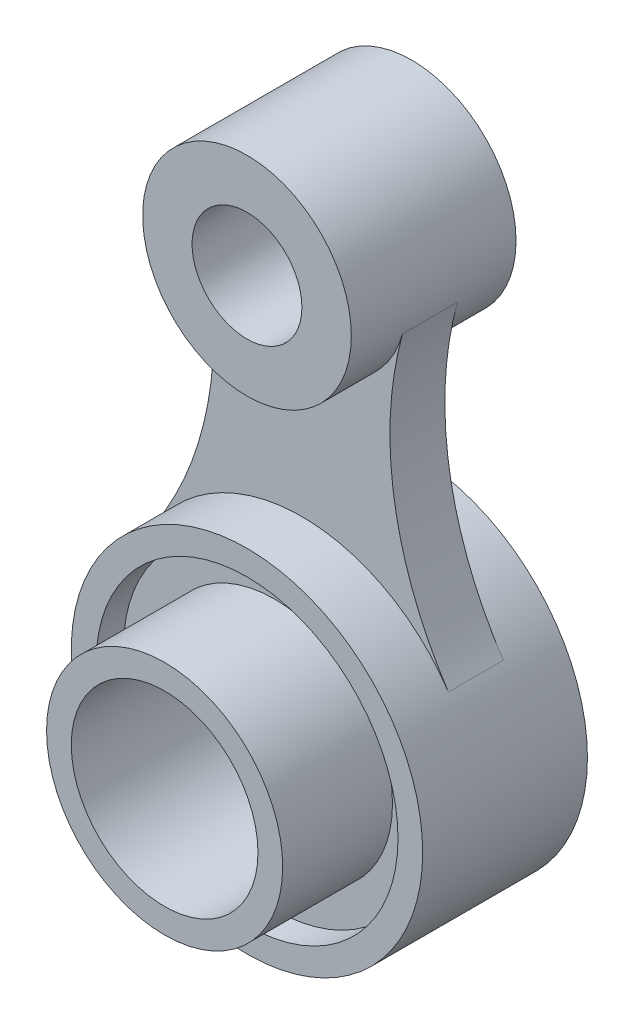
ISO-10303-21;
HEADER;
FILE_DESCRIPTION(('STEP AP214'),'2;1');
FILE_NAME('part.step','',(''),(''),'','','');
FILE_SCHEMA(('AUTOMOTIVE_DESIGN { 1 0 10303 214 1 1 1 1 }'));
ENDSEC;
DATA;
#1=APPLICATION_CONTEXT('core data for automotive mechanical design processes');
#2=APPLICATION_PROTOCOL_DEFINITION('international standard','automotive_design',2000,#1);
#3=PRODUCT_CONTEXT('',#1,'mechanical');
#4=PRODUCT('Part','Part','',(#3));
#5=PRODUCT_RELATED_PRODUCT_CATEGORY('part','',(#4));
#6=PRODUCT_DEFINITION_FORMATION('','',#4);
#7=PRODUCT_DEFINITION_CONTEXT('part definition',#1,'design');
#8=PRODUCT_DEFINITION('design','',#6,#7);
#9=PRODUCT_DEFINITION_SHAPE('','',#8);
#10=(LENGTH_UNIT() NAMED_UNIT(*) SI_UNIT(.MILLI.,.METRE.));
#11=(NAMED_UNIT(*) PLANE_ANGLE_UNIT() SI_UNIT($,.RADIAN.));
#12=(NAMED_UNIT(*) SI_UNIT($,.STERADIAN.) SOLID_ANGLE_UNIT());
#13=UNCERTAINTY_MEASURE_WITH_UNIT(LENGTH_MEASURE(1.E-05),#10,'distance_accuracy_value','');
#14=(GEOMETRIC_REPRESENTATION_CONTEXT(3) GLOBAL_UNCERTAINTY_ASSIGNED_CONTEXT((#13)) GLOBAL_UNIT_ASSIGNED_CONTEXT((#10,
#11,#12)) REPRESENTATION_CONTEXT('',''));
#15=CARTESIAN_POINT('',(0.,0.,0.));
#16=DIRECTION('',(0.,0.,1.));
#17=DIRECTION('',(1.,0.,0.));
#18=AXIS2_PLACEMENT_3D('',#15,#16,#17);
#19=CARTESIAN_POINT('',(0.,75.,15.));
#20=DIRECTION('',(0.,0.,1.));
#21=DIRECTION('',(1.,0.,0.));
#22=AXIS2_PLACEMENT_3D('',#19,#20,#21);
#23=PLANE('',#22);
#24=CARTESIAN_POINT('',(0.,75.,15.));
#25=DIRECTION('',(0.,0.,1.));
#26=DIRECTION('',(1.,0.,0.));
#27=AXIS2_PLACEMENT_3D('',#24,#25,#26);
#28=CIRCLE('',#27,19.);
#29=CARTESIAN_POINT('',(19.,75.,15.));
#30=VERTEX_POINT('',#29);
#31=EDGE_CURVE('E12',#30,#30,#28,.T.);
#32=ORIENTED_EDGE('',*,*,#31,.T.);
#33=EDGE_LOOP('',(#32));
#34=FACE_BOUND('',#33,.T.);
#35=CARTESIAN_POINT('',(0.,75.,15.));
#36=DIRECTION('',(0.,0.,1.));
#37=DIRECTION('',(1.,0.,0.));
#38=AXIS2_PLACEMENT_3D('',#35,#36,#37);
#39=CIRCLE('',#38,10.);
#40=CARTESIAN_POINT('',(10.,75.,15.));
#41=VERTEX_POINT('',#40);
#42=EDGE_CURVE('E127',#41,#41,#39,.T.);
#43=ORIENTED_EDGE('',*,*,#42,.F.);
#44=EDGE_LOOP('',(#43));
#45=FACE_BOUND('',#44,.T.);
#46=ADVANCED_FACE('F51',(#34,#45),#23,.T.);
#47=CARTESIAN_POINT('',(0.,75.,-15.));
#48=DIRECTION('',(0.,0.,1.));
#49=DIRECTION('',(1.,0.,0.));
#50=AXIS2_PLACEMENT_3D('',#47,#48,#49);
#51=PLANE('',#50);
#52=CARTESIAN_POINT('',(0.,75.,-15.));
#53=DIRECTION('',(0.,0.,1.));
#54=DIRECTION('',(1.,0.,0.));
#55=AXIS2_PLACEMENT_3D('',#52,#53,#54);
#56=CIRCLE('',#55,19.);
#57=CARTESIAN_POINT('',(19.,75.,-15.));
#58=VERTEX_POINT('',#57);
#59=EDGE_CURVE('E55',#58,#58,#56,.T.);
#60=ORIENTED_EDGE('',*,*,#59,.F.);
#61=EDGE_LOOP('',(#60));
#62=FACE_BOUND('',#61,.T.);
#63=CARTESIAN_POINT('',(0.,75.,-15.));
#64=DIRECTION('',(0.,0.,1.));
#65=DIRECTION('',(1.,0.,0.));
#66=AXIS2_PLACEMENT_3D('',#63,#64,#65);
#67=CIRCLE('',#66,10.);
#68=CARTESIAN_POINT('',(10.,75.,-15.));
#69=VERTEX_POINT('',#68);
#70=EDGE_CURVE('E126',#69,#69,#67,.T.);
#71=ORIENTED_EDGE('',*,*,#70,.T.);
#72=EDGE_LOOP('',(#71));
#73=FACE_BOUND('',#72,.T.);
#74=ADVANCED_FACE('F133',(#62,#73),#51,.F.);
#75=CARTESIAN_POINT('',(0.,75.,15.));
#76=DIRECTION('',(0.,0.,-1.));
#77=DIRECTION('',(-1.,0.,0.));
#78=AXIS2_PLACEMENT_3D('',#75,#76,#77);
#79=CYLINDRICAL_SURFACE('',#78,19.);
#80=DIRECTION('',(0.,0.,-1.));
#81=VECTOR('',#80,1.);
#82=CARTESIAN_POINT('',(-18.3212439861572,69.9669076305221,5.));
#83=LINE('',#82,#81);
#84=CARTESIAN_POINT('',(-18.3212439861572,69.9669076305221,5.));
#85=VERTEX_POINT('',#84);
#86=CARTESIAN_POINT('',(-18.3212439861572,69.9669076305221,-5.));
#87=VERTEX_POINT('',#86);
#88=EDGE_CURVE('E66',#85,#87,#83,.T.);
#89=ORIENTED_EDGE('',*,*,#88,.F.);
#90=CARTESIAN_POINT('',(0.,75.,5.));
#91=DIRECTION('',(0.,0.,-1.));
#92=DIRECTION('',(1.,0.,0.));
#93=AXIS2_PLACEMENT_3D('',#90,#91,#92);
#94=CIRCLE('',#93,19.);
#95=CARTESIAN_POINT('',(18.3212439861572,69.9669076305221,5.));
#96=VERTEX_POINT('',#95);
#97=EDGE_CURVE('E70',#96,#85,#94,.T.);
#98=ORIENTED_EDGE('',*,*,#97,.F.);
#99=DIRECTION('',(0.,0.,-1.));
#100=VECTOR('',#99,1.);
#101=CARTESIAN_POINT('',(18.3212439861572,69.9669076305221,5.));
#102=LINE('',#101,#100);
#103=CARTESIAN_POINT('',(18.3212439861572,69.9669076305221,-5.));
#104=VERTEX_POINT('',#103);
#105=EDGE_CURVE('E109',#96,#104,#102,.T.);
#106=ORIENTED_EDGE('',*,*,#105,.T.);
#107=CARTESIAN_POINT('',(0.,75.,-5.));
#108=DIRECTION('',(0.,0.,-1.));
#109=DIRECTION('',(1.,0.,0.));
#110=AXIS2_PLACEMENT_3D('',#107,#108,#109);
#111=CIRCLE('',#110,19.);
#112=EDGE_CURVE('E97',#104,#87,#111,.T.);
#113=ORIENTED_EDGE('',*,*,#112,.T.);
#114=EDGE_LOOP('',(#89,#98,#106,#113));
#115=FACE_BOUND('',#114,.T.);
#116=ORIENTED_EDGE('',*,*,#31,.F.);
#117=EDGE_LOOP('',(#116));
#118=FACE_BOUND('',#117,.T.);
#119=ORIENTED_EDGE('',*,*,#59,.T.);
#120=EDGE_LOOP('',(#119));
#121=FACE_BOUND('',#120,.T.);
#122=ADVANCED_FACE('F53',(#115,#118,#121),#79,.T.);
#123=CARTESIAN_POINT('',(0.,75.,15.));
#124=DIRECTION('',(0.,0.,-1.));
#125=DIRECTION('',(-1.,0.,0.));
#126=AXIS2_PLACEMENT_3D('',#123,#124,#125);
#127=CYLINDRICAL_SURFACE('',#126,10.);
#128=ORIENTED_EDGE('',*,*,#42,.T.);
#129=EDGE_LOOP('',(#128));
#130=FACE_BOUND('',#129,.T.);
#131=ORIENTED_EDGE('',*,*,#70,.F.);
#132=EDGE_LOOP('',(#131));
#133=FACE_BOUND('',#132,.T.);
#134=ADVANCED_FACE('F135',(#130,#133),#127,.F.);
#135=CARTESIAN_POINT('',(-80.034907939529,53.0133333333333,5.));
#136=DIRECTION('',(0.,0.,-1.));
#137=DIRECTION('',(-1.,0.,0.));
#138=AXIS2_PLACEMENT_3D('',#135,#136,#137);
#139=CYLINDRICAL_SURFACE('',#138,64.);
#140=CARTESIAN_POINT('',(-80.034907939529,53.0133333333333,-5.));
#141=DIRECTION('',(0.,0.,-1.));
#142=DIRECTION('',(1.,0.,0.));
#143=AXIS2_PLACEMENT_3D('',#140,#141,#142);
#144=CIRCLE('',#143,64.);
#145=CARTESIAN_POINT('',(-26.6783026465097,17.6711111111111,-5.));
#146=VERTEX_POINT('',#145);
#147=EDGE_CURVE('E115',#87,#146,#144,.T.);
#148=ORIENTED_EDGE('',*,*,#147,.T.);
#149=DIRECTION('',(0.,0.,-1.));
#150=VECTOR('',#149,1.);
#151=CARTESIAN_POINT('',(-26.6783026465097,17.6711111111111,5.));
#152=LINE('',#151,#150);
#153=CARTESIAN_POINT('',(-26.6783026465097,17.6711111111111,5.));
#154=VERTEX_POINT('',#153);
#155=EDGE_CURVE('E108',#154,#146,#152,.T.);
#156=ORIENTED_EDGE('',*,*,#155,.F.);
#157=CARTESIAN_POINT('',(-80.034907939529,53.0133333333333,5.));
#158=DIRECTION('',(0.,0.,-1.));
#159=DIRECTION('',(1.,0.,0.));
#160=AXIS2_PLACEMENT_3D('',#157,#158,#159);
#161=CIRCLE('',#160,64.);
#162=EDGE_CURVE('E122',#85,#154,#161,.T.);
#163=ORIENTED_EDGE('',*,*,#162,.F.);
#164=ORIENTED_EDGE('',*,*,#88,.T.);
#165=EDGE_LOOP('',(#148,#156,#163,#164));
#166=FACE_BOUND('',#165,.T.);
#167=ADVANCED_FACE('F137',(#166),#139,.F.);
#168=CARTESIAN_POINT('',(80.034907939529,53.0133333333333,5.));
#169=DIRECTION('',(0.,0.,-1.));
#170=DIRECTION('',(-1.,0.,0.));
#171=AXIS2_PLACEMENT_3D('',#168,#169,#170);
#172=CYLINDRICAL_SURFACE('',#171,64.);
#173=CARTESIAN_POINT('',(80.034907939529,53.0133333333333,-5.));
#174=DIRECTION('',(0.,0.,-1.));
#175=DIRECTION('',(1.,0.,0.));
#176=AXIS2_PLACEMENT_3D('',#173,#174,#175);
#177=CIRCLE('',#176,64.);
#178=CARTESIAN_POINT('',(26.6783026465097,17.6711111111111,-5.));
#179=VERTEX_POINT('',#178);
#180=EDGE_CURVE('E90',#179,#104,#177,.T.);
#181=ORIENTED_EDGE('',*,*,#180,.T.);
#182=ORIENTED_EDGE('',*,*,#105,.F.);
#183=CARTESIAN_POINT('',(80.034907939529,53.0133333333333,5.));
#184=DIRECTION('',(0.,0.,-1.));
#185=DIRECTION('',(1.,0.,0.));
#186=AXIS2_PLACEMENT_3D('',#183,#184,#185);
#187=CIRCLE('',#186,64.);
#188=CARTESIAN_POINT('',(26.6783026465097,17.6711111111111,5.));
#189=VERTEX_POINT('',#188);
#190=EDGE_CURVE('E105',#189,#96,#187,.T.);
#191=ORIENTED_EDGE('',*,*,#190,.F.);
#192=DIRECTION('',(0.,0.,-1.));
#193=VECTOR('',#192,1.);
#194=CARTESIAN_POINT('',(26.6783026465097,17.6711111111111,5.));
#195=LINE('',#194,#193);
#196=EDGE_CURVE('E103',#189,#179,#195,.T.);
#197=ORIENTED_EDGE('',*,*,#196,.T.);
#198=EDGE_LOOP('',(#181,#182,#191,#197));
#199=FACE_BOUND('',#198,.T.);
#200=ADVANCED_FACE('F104',(#199),#172,.F.);
#201=CARTESIAN_POINT('',(-40.0174539697645,64.0066666666667,5.));
#202=DIRECTION('',(0.,0.,1.));
#203=DIRECTION('',(1.,0.,0.));
#204=AXIS2_PLACEMENT_3D('',#201,#202,#203);
#205=PLANE('',#204);
#206=ORIENTED_EDGE('',*,*,#162,.T.);
#207=CARTESIAN_POINT('',(0.,0.,5.));
#208=DIRECTION('',(0.,0.,-1.));
#209=DIRECTION('',(1.,0.,0.));
#210=AXIS2_PLACEMENT_3D('',#207,#208,#209);
#211=CIRCLE('',#210,32.);
#212=EDGE_CURVE('E389',#154,#189,#211,.T.);
#213=ORIENTED_EDGE('',*,*,#212,.T.);
#214=ORIENTED_EDGE('',*,*,#190,.T.);
#215=ORIENTED_EDGE('',*,*,#97,.T.);
#216=EDGE_LOOP('',(#206,#213,#214,#215));
#217=FACE_BOUND('',#216,.T.);
#218=ADVANCED_FACE('F190',(#217),#205,.T.);
#219=CARTESIAN_POINT('',(-40.0174539697645,64.0066666666667,-5.));
#220=DIRECTION('',(0.,0.,1.));
#221=DIRECTION('',(1.,0.,0.));
#222=AXIS2_PLACEMENT_3D('',#219,#220,#221);
#223=PLANE('',#222);
#224=ORIENTED_EDGE('',*,*,#147,.F.);
#225=ORIENTED_EDGE('',*,*,#112,.F.);
#226=ORIENTED_EDGE('',*,*,#180,.F.);
#227=CARTESIAN_POINT('',(0.,0.,-5.));
#228=DIRECTION('',(0.,0.,-1.));
#229=DIRECTION('',(1.,0.,0.));
#230=AXIS2_PLACEMENT_3D('',#227,#228,#229);
#231=CIRCLE('',#230,32.);
#232=EDGE_CURVE('E95',#146,#179,#231,.T.);
#233=ORIENTED_EDGE('',*,*,#232,.F.);
#234=EDGE_LOOP('',(#224,#225,#226,#233));
#235=FACE_BOUND('',#234,.T.);
#236=ADVANCED_FACE('F93',(#235),#223,.F.);
#237=CARTESIAN_POINT('',(0.,0.,15.));
#238=DIRECTION('',(0.,0.,1.));
#239=DIRECTION('',(1.,0.,0.));
#240=AXIS2_PLACEMENT_3D('',#237,#238,#239);
#241=PLANE('',#240);
#242=CARTESIAN_POINT('',(0.,0.,15.));
#243=DIRECTION('',(0.,0.,1.));
#244=DIRECTION('',(1.,0.,0.));
#245=AXIS2_PLACEMENT_3D('',#242,#243,#244);
#246=CIRCLE('',#245,27.5);
#247=CARTESIAN_POINT('',(27.5,0.,15.));
#248=VERTEX_POINT('',#247);
#249=EDGE_CURVE('E374',#248,#248,#246,.T.);
#250=ORIENTED_EDGE('',*,*,#249,.F.);
#251=EDGE_LOOP('',(#250));
#252=FACE_BOUND('',#251,.T.);
#253=CARTESIAN_POINT('',(0.,0.,15.));
#254=DIRECTION('',(0.,0.,1.));
#255=DIRECTION('',(1.,0.,0.));
#256=AXIS2_PLACEMENT_3D('',#253,#254,#255);
#257=CIRCLE('',#256,32.);
#258=CARTESIAN_POINT('',(32.,0.,15.));
#259=VERTEX_POINT('',#258);
#260=EDGE_CURVE('E117',#259,#259,#257,.T.);
#261=ORIENTED_EDGE('',*,*,#260,.T.);
#262=EDGE_LOOP('',(#261));
#263=FACE_BOUND('',#262,.T.);
#264=ADVANCED_FACE('F209',(#252,#263),#241,.T.);
#265=CARTESIAN_POINT('',(0.,0.,-15.));
#266=DIRECTION('',(0.,0.,1.));
#267=DIRECTION('',(1.,0.,0.));
#268=AXIS2_PLACEMENT_3D('',#265,#266,#267);
#269=PLANE('',#268);
#270=CARTESIAN_POINT('',(0.,0.,-15.));
#271=DIRECTION('',(0.,0.,1.));
#272=DIRECTION('',(1.,0.,0.));
#273=AXIS2_PLACEMENT_3D('',#270,#271,#272);
#274=CIRCLE('',#273,32.);
#275=CARTESIAN_POINT('',(32.,0.,-15.));
#276=VERTEX_POINT('',#275);
#277=EDGE_CURVE('E383',#276,#276,#274,.T.);
#278=ORIENTED_EDGE('',*,*,#277,.F.);
#279=EDGE_LOOP('',(#278));
#280=FACE_BOUND('',#279,.T.);
#281=CARTESIAN_POINT('',(0.,0.,-15.));
#282=DIRECTION('',(0.,0.,1.));
#283=DIRECTION('',(1.,0.,0.));
#284=AXIS2_PLACEMENT_3D('',#281,#282,#283);
#285=CIRCLE('',#284,17.);
#286=CARTESIAN_POINT('',(17.,0.,-15.));
#287=VERTEX_POINT('',#286);
#288=EDGE_CURVE('E378',#287,#287,#285,.T.);
#289=ORIENTED_EDGE('',*,*,#288,.T.);
#290=EDGE_LOOP('',(#289));
#291=FACE_BOUND('',#290,.T.);
#292=ADVANCED_FACE('F218',(#280,#291),#269,.F.);
#293=CARTESIAN_POINT('',(0.,0.,15.));
#294=DIRECTION('',(0.,0.,-1.));
#295=DIRECTION('',(-1.,0.,0.));
#296=AXIS2_PLACEMENT_3D('',#293,#294,#295);
#297=CYLINDRICAL_SURFACE('',#296,32.);
#298=ORIENTED_EDGE('',*,*,#212,.F.);
#299=ORIENTED_EDGE('',*,*,#155,.T.);
#300=ORIENTED_EDGE('',*,*,#232,.T.);
#301=ORIENTED_EDGE('',*,*,#196,.F.);
#302=EDGE_LOOP('',(#298,#299,#300,#301));
#303=FACE_BOUND('',#302,.T.);
#304=ORIENTED_EDGE('',*,*,#260,.F.);
#305=EDGE_LOOP('',(#304));
#306=FACE_BOUND('',#305,.T.);
#307=ORIENTED_EDGE('',*,*,#277,.T.);
#308=EDGE_LOOP('',(#307));
#309=FACE_BOUND('',#308,.T.);
#310=ADVANCED_FACE('F112',(#303,#306,#309),#297,.T.);
#311=CARTESIAN_POINT('',(0.,0.,15.));
#312=DIRECTION('',(0.,0.,-1.));
#313=DIRECTION('',(-1.,0.,0.));
#314=AXIS2_PLACEMENT_3D('',#311,#312,#313);
#315=CYLINDRICAL_SURFACE('',#314,17.);
#316=ORIENTED_EDGE('',*,*,#288,.F.);
#317=EDGE_LOOP('',(#316));
#318=FACE_BOUND('',#317,.T.);
#319=CARTESIAN_POINT('',(0.,0.,30.));
#320=DIRECTION('',(0.,0.,1.));
#321=DIRECTION('',(1.,0.,0.));
#322=AXIS2_PLACEMENT_3D('',#319,#320,#321);
#323=CIRCLE('',#322,17.);
#324=CARTESIAN_POINT('',(17.,0.,30.));
#325=VERTEX_POINT('',#324);
#326=EDGE_CURVE('E366',#325,#325,#323,.T.);
#327=ORIENTED_EDGE('',*,*,#326,.T.);
#328=EDGE_LOOP('',(#327));
#329=FACE_BOUND('',#328,.T.);
#330=ADVANCED_FACE('F236',(#318,#329),#315,.F.);
#331=CARTESIAN_POINT('',(0.,0.,10.));
#332=DIRECTION('',(0.,0.,1.));
#333=DIRECTION('',(1.,0.,0.));
#334=AXIS2_PLACEMENT_3D('',#331,#332,#333);
#335=CYLINDRICAL_SURFACE('',#334,27.5);
#336=CARTESIAN_POINT('',(0.,0.,10.));
#337=DIRECTION('',(0.,0.,1.));
#338=DIRECTION('',(1.,0.,0.));
#339=AXIS2_PLACEMENT_3D('',#336,#337,#338);
#340=CIRCLE('',#339,27.5);
#341=CARTESIAN_POINT('',(27.5,0.,10.));
#342=VERTEX_POINT('',#341);
#343=EDGE_CURVE('E375',#342,#342,#340,.T.);
#344=ORIENTED_EDGE('',*,*,#343,.F.);
#345=EDGE_LOOP('',(#344));
#346=FACE_BOUND('',#345,.T.);
#347=ORIENTED_EDGE('',*,*,#249,.T.);
#348=EDGE_LOOP('',(#347));
#349=FACE_BOUND('',#348,.T.);
#350=ADVANCED_FACE('F244',(#346,#349),#335,.F.);
#351=CARTESIAN_POINT('',(0.,0.,10.));
#352=DIRECTION('',(0.,0.,1.));
#353=DIRECTION('',(1.,0.,0.));
#354=AXIS2_PLACEMENT_3D('',#351,#352,#353);
#355=PLANE('',#354);
#356=CARTESIAN_POINT('',(0.,0.,10.));
#357=DIRECTION('',(0.,0.,1.));
#358=DIRECTION('',(1.,0.,0.));
#359=AXIS2_PLACEMENT_3D('',#356,#357,#358);
#360=CIRCLE('',#359,21.5);
#361=CARTESIAN_POINT('',(21.5,0.,10.));
#362=VERTEX_POINT('',#361);
#363=EDGE_CURVE('E369',#362,#362,#360,.T.);
#364=ORIENTED_EDGE('',*,*,#363,.F.);
#365=EDGE_LOOP('',(#364));
#366=FACE_BOUND('',#365,.T.);
#367=ORIENTED_EDGE('',*,*,#343,.T.);
#368=EDGE_LOOP('',(#367));
#369=FACE_BOUND('',#368,.T.);
#370=ADVANCED_FACE('F254',(#366,#369),#355,.T.);
#371=CARTESIAN_POINT('',(0.,0.,10.));
#372=DIRECTION('',(0.,0.,1.));
#373=DIRECTION('',(1.,0.,0.));
#374=AXIS2_PLACEMENT_3D('',#371,#372,#373);
#375=CYLINDRICAL_SURFACE('',#374,21.5);
#376=ORIENTED_EDGE('',*,*,#363,.T.);
#377=EDGE_LOOP('',(#376));
#378=FACE_BOUND('',#377,.T.);
#379=CARTESIAN_POINT('',(0.,0.,30.));
#380=DIRECTION('',(0.,0.,1.));
#381=DIRECTION('',(1.,0.,0.));
#382=AXIS2_PLACEMENT_3D('',#379,#380,#381);
#383=CIRCLE('',#382,21.5);
#384=CARTESIAN_POINT('',(21.5,0.,30.));
#385=VERTEX_POINT('',#384);
#386=EDGE_CURVE('E363',#385,#385,#383,.T.);
#387=ORIENTED_EDGE('',*,*,#386,.F.);
#388=EDGE_LOOP('',(#387));
#389=FACE_BOUND('',#388,.T.);
#390=ADVANCED_FACE('F263',(#378,#389),#375,.T.);
#391=CARTESIAN_POINT('',(0.,0.,30.));
#392=DIRECTION('',(0.,0.,1.));
#393=DIRECTION('',(1.,0.,0.));
#394=AXIS2_PLACEMENT_3D('',#391,#392,#393);
#395=PLANE('',#394);
#396=ORIENTED_EDGE('',*,*,#386,.T.);
#397=EDGE_LOOP('',(#396));
#398=FACE_BOUND('',#397,.T.);
#399=ORIENTED_EDGE('',*,*,#326,.F.);
#400=EDGE_LOOP('',(#399));
#401=FACE_BOUND('',#400,.T.);
#402=ADVANCED_FACE('F272',(#398,#401),#395,.T.);
#403=CLOSED_SHELL('',(#46,#74,#122,#134,#167,#200,#218,#236,#264,#292,#310,#330,#350,#370,#390,#402));
#404=MANIFOLD_SOLID_BREP('B2',#403);
#405=ADVANCED_BREP_SHAPE_REPRESENTATION('',(#18,#404),#14);
#406=SHAPE_DEFINITION_REPRESENTATION(#9,#405);
ENDSEC;
END-ISO-10303-21;
